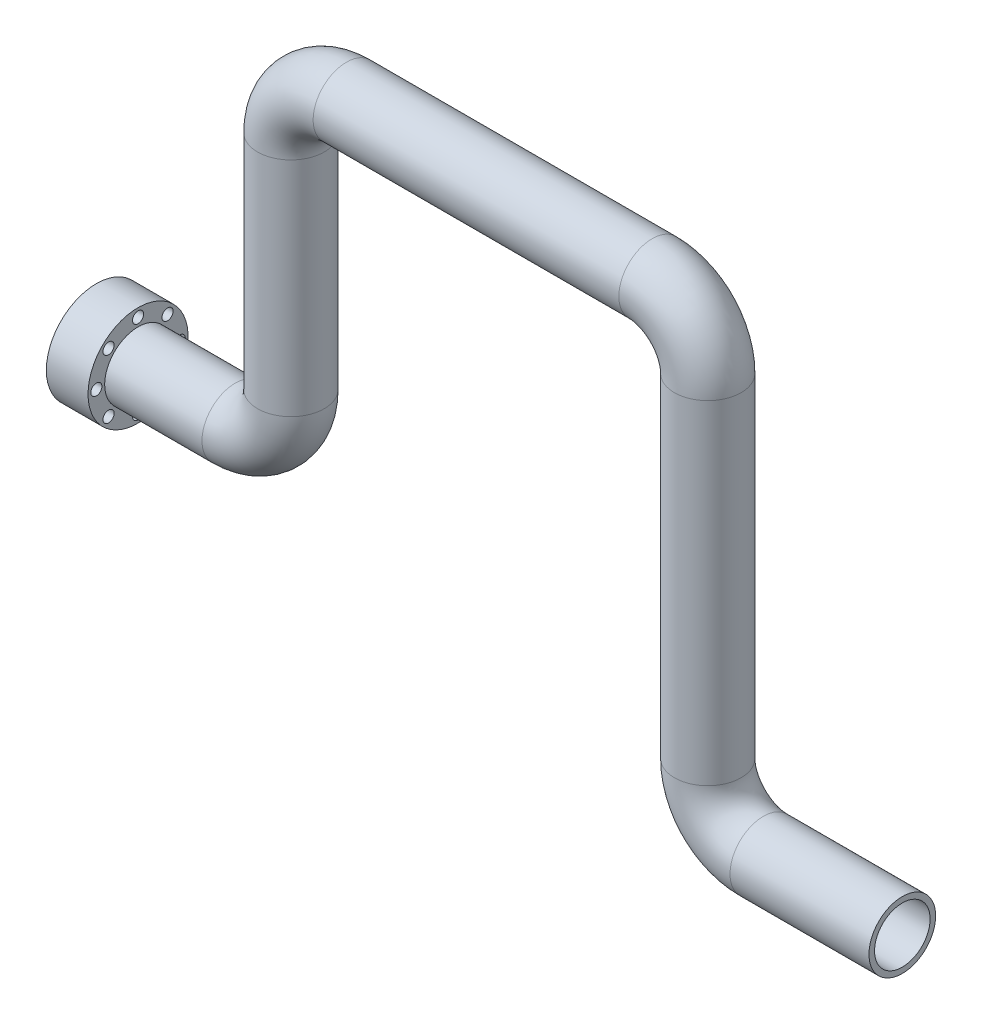
ISO-10303-21;
HEADER;
FILE_DESCRIPTION(('STEP AP214'),'2;1');
FILE_NAME('part.step','',(''),(''),'','','');
FILE_SCHEMA(('AUTOMOTIVE_DESIGN { 1 0 10303 214 1 1 1 1 }'));
ENDSEC;
DATA;
#1=APPLICATION_CONTEXT('core data for automotive mechanical design processes');
#2=APPLICATION_PROTOCOL_DEFINITION('international standard','automotive_design',2000,#1);
#3=PRODUCT_CONTEXT('',#1,'mechanical');
#4=PRODUCT('Part','Part','',(#3));
#5=PRODUCT_RELATED_PRODUCT_CATEGORY('part','',(#4));
#6=PRODUCT_DEFINITION_FORMATION('','',#4);
#7=PRODUCT_DEFINITION_CONTEXT('part definition',#1,'design');
#8=PRODUCT_DEFINITION('design','',#6,#7);
#9=PRODUCT_DEFINITION_SHAPE('','',#8);
#10=(LENGTH_UNIT() NAMED_UNIT(*) SI_UNIT(.MILLI.,.METRE.));
#11=(NAMED_UNIT(*) PLANE_ANGLE_UNIT() SI_UNIT($,.RADIAN.));
#12=(NAMED_UNIT(*) SI_UNIT($,.STERADIAN.) SOLID_ANGLE_UNIT());
#13=UNCERTAINTY_MEASURE_WITH_UNIT(LENGTH_MEASURE(1.E-05),#10,'distance_accuracy_value','');
#14=(GEOMETRIC_REPRESENTATION_CONTEXT(3) GLOBAL_UNCERTAINTY_ASSIGNED_CONTEXT((#13)) GLOBAL_UNIT_ASSIGNED_CONTEXT((#10,
#11,#12)) REPRESENTATION_CONTEXT('',''));
#15=CARTESIAN_POINT('',(0.,0.,0.));
#16=DIRECTION('',(0.,0.,1.));
#17=DIRECTION('',(1.,0.,0.));
#18=AXIS2_PLACEMENT_3D('',#15,#16,#17);
#19=CARTESIAN_POINT('',(7.5,0.,0.));
#20=DIRECTION('',(-1.,0.,0.));
#21=DIRECTION('',(0.,0.,1.));
#22=AXIS2_PLACEMENT_3D('',#19,#20,#21);
#23=CYLINDRICAL_SURFACE('',#22,9.);
#24=CARTESIAN_POINT('',(7.5,0.,0.));
#25=DIRECTION('',(-1.,0.,0.));
#26=DIRECTION('',(0.,0.,1.));
#27=AXIS2_PLACEMENT_3D('',#24,#25,#26);
#28=CIRCLE('',#27,9.);
#29=CARTESIAN_POINT('',(7.5,0.,9.));
#30=VERTEX_POINT('',#29);
#31=EDGE_CURVE('E11',#30,#30,#28,.T.);
#32=ORIENTED_EDGE('',*,*,#31,.T.);
#33=EDGE_LOOP('',(#32));
#34=FACE_BOUND('',#33,.T.);
#35=CARTESIAN_POINT('',(0.,0.,0.));
#36=DIRECTION('',(-1.,0.,0.));
#37=DIRECTION('',(0.,0.,1.));
#38=AXIS2_PLACEMENT_3D('',#35,#36,#37);
#39=CIRCLE('',#38,9.);
#40=CARTESIAN_POINT('',(0.,0.,9.));
#41=VERTEX_POINT('',#40);
#42=EDGE_CURVE('E54',#41,#41,#39,.T.);
#43=ORIENTED_EDGE('',*,*,#42,.F.);
#44=EDGE_LOOP('',(#43));
#45=FACE_BOUND('',#44,.T.);
#46=ADVANCED_FACE('F51',(#34,#45),#23,.T.);
#47=CARTESIAN_POINT('',(7.5,0.,0.));
#48=DIRECTION('',(-1.,0.,0.));
#49=DIRECTION('',(0.,0.,1.));
#50=AXIS2_PLACEMENT_3D('',#47,#48,#49);
#51=PLANE('',#50);
#52=CARTESIAN_POINT('',(7.5,5.3033008588991,5.30330085889912));
#53=DIRECTION('',(-1.,0.,0.));
#54=DIRECTION('',(0.,0.,1.));
#55=AXIS2_PLACEMENT_3D('',#52,#53,#54);
#56=CIRCLE('',#55,1.);
#57=CARTESIAN_POINT('',(7.5,5.3033008588991,6.30330085889912));
#58=VERTEX_POINT('',#57);
#59=EDGE_CURVE('E66',#58,#58,#56,.T.);
#60=ORIENTED_EDGE('',*,*,#59,.T.);
#61=EDGE_LOOP('',(#60));
#62=FACE_BOUND('',#61,.T.);
#63=CARTESIAN_POINT('',(7.5,0.,7.5));
#64=DIRECTION('',(-1.,0.,0.));
#65=DIRECTION('',(0.,0.,1.));
#66=AXIS2_PLACEMENT_3D('',#63,#64,#65);
#67=CIRCLE('',#66,1.);
#68=CARTESIAN_POINT('',(7.5,0.,8.5));
#69=VERTEX_POINT('',#68);
#70=EDGE_CURVE('E71',#69,#69,#67,.T.);
#71=ORIENTED_EDGE('',*,*,#70,.T.);
#72=EDGE_LOOP('',(#71));
#73=FACE_BOUND('',#72,.T.);
#74=CARTESIAN_POINT('',(7.5,7.5,0.));
#75=DIRECTION('',(-1.,0.,0.));
#76=DIRECTION('',(0.,0.,1.));
#77=AXIS2_PLACEMENT_3D('',#74,#75,#76);
#78=CIRCLE('',#77,1.);
#79=CARTESIAN_POINT('',(7.5,7.5,1.));
#80=VERTEX_POINT('',#79);
#81=EDGE_CURVE('E74',#80,#80,#78,.T.);
#82=ORIENTED_EDGE('',*,*,#81,.T.);
#83=EDGE_LOOP('',(#82));
#84=FACE_BOUND('',#83,.T.);
#85=CARTESIAN_POINT('',(7.5,5.30330085889917,-5.30330085889904));
#86=DIRECTION('',(-1.,0.,0.));
#87=DIRECTION('',(0.,0.,1.));
#88=AXIS2_PLACEMENT_3D('',#85,#86,#87);
#89=CIRCLE('',#88,1.);
#90=CARTESIAN_POINT('',(7.5,5.30330085889917,-4.30330085889904));
#91=VERTEX_POINT('',#90);
#92=EDGE_CURVE('E77',#91,#91,#89,.T.);
#93=ORIENTED_EDGE('',*,*,#92,.T.);
#94=EDGE_LOOP('',(#93));
#95=FACE_BOUND('',#94,.T.);
#96=CARTESIAN_POINT('',(7.5,-5.30330085889906,-5.30330085889915));
#97=DIRECTION('',(-1.,0.,0.));
#98=DIRECTION('',(0.,0.,1.));
#99=AXIS2_PLACEMENT_3D('',#96,#97,#98);
#100=CIRCLE('',#99,1.);
#101=CARTESIAN_POINT('',(7.5,-5.30330085889906,-4.30330085889915));
#102=VERTEX_POINT('',#101);
#103=EDGE_CURVE('E80',#102,#102,#100,.T.);
#104=ORIENTED_EDGE('',*,*,#103,.T.);
#105=EDGE_LOOP('',(#104));
#106=FACE_BOUND('',#105,.T.);
#107=CARTESIAN_POINT('',(7.5,-5.30330085889913,5.30330085889908));
#108=DIRECTION('',(-1.,0.,0.));
#109=DIRECTION('',(0.,0.,1.));
#110=AXIS2_PLACEMENT_3D('',#107,#108,#109);
#111=CIRCLE('',#110,0.999999999999999);
#112=CARTESIAN_POINT('',(7.5,-5.30330085889913,6.30330085889908));
#113=VERTEX_POINT('',#112);
#114=EDGE_CURVE('E83',#113,#113,#111,.T.);
#115=ORIENTED_EDGE('',*,*,#114,.T.);
#116=EDGE_LOOP('',(#115));
#117=FACE_BOUND('',#116,.T.);
#118=CARTESIAN_POINT('',(7.5,0.,-7.5));
#119=DIRECTION('',(-1.,0.,0.));
#120=DIRECTION('',(0.,0.,1.));
#121=AXIS2_PLACEMENT_3D('',#118,#119,#120);
#122=CIRCLE('',#121,1.);
#123=CARTESIAN_POINT('',(7.5,0.,-6.5));
#124=VERTEX_POINT('',#123);
#125=EDGE_CURVE('E86',#124,#124,#122,.T.);
#126=ORIENTED_EDGE('',*,*,#125,.T.);
#127=EDGE_LOOP('',(#126));
#128=FACE_BOUND('',#127,.T.);
#129=CARTESIAN_POINT('',(7.5,-7.5,0.));
#130=DIRECTION('',(-1.,0.,0.));
#131=DIRECTION('',(0.,0.,1.));
#132=AXIS2_PLACEMENT_3D('',#129,#130,#131);
#133=CIRCLE('',#132,1.);
#134=CARTESIAN_POINT('',(7.5,-7.5,0.999999999999948));
#135=VERTEX_POINT('',#134);
#136=EDGE_CURVE('E89',#135,#135,#133,.T.);
#137=ORIENTED_EDGE('',*,*,#136,.T.);
#138=EDGE_LOOP('',(#137));
#139=FACE_BOUND('',#138,.T.);
#140=CARTESIAN_POINT('',(7.5,0.,0.));
#141=DIRECTION('',(-1.,0.,0.));
#142=DIRECTION('',(0.,0.,1.));
#143=AXIS2_PLACEMENT_3D('',#140,#141,#142);
#144=CIRCLE('',#143,6.);
#145=CARTESIAN_POINT('',(7.5,0.,6.));
#146=VERTEX_POINT('',#145);
#147=EDGE_CURVE('E61',#146,#146,#144,.T.);
#148=ORIENTED_EDGE('',*,*,#147,.T.);
#149=EDGE_LOOP('',(#148));
#150=FACE_BOUND('',#149,.T.);
#151=ORIENTED_EDGE('',*,*,#31,.F.);
#152=EDGE_LOOP('',(#151));
#153=FACE_BOUND('',#152,.T.);
#154=ADVANCED_FACE('F124',(#62,#73,#84,#95,#106,#117,#128,#139,#150,#153),#51,.F.);
#155=CARTESIAN_POINT('',(0.,0.,0.));
#156=DIRECTION('',(-1.,0.,0.));
#157=DIRECTION('',(0.,0.,1.));
#158=AXIS2_PLACEMENT_3D('',#155,#156,#157);
#159=PLANE('',#158);
#160=CARTESIAN_POINT('',(0.,5.3033008588991,5.30330085889912));
#161=DIRECTION('',(-1.,0.,0.));
#162=DIRECTION('',(0.,0.,1.));
#163=AXIS2_PLACEMENT_3D('',#160,#161,#162);
#164=CIRCLE('',#163,1.);
#165=CARTESIAN_POINT('',(0.,5.3033008588991,6.30330085889912));
#166=VERTEX_POINT('',#165);
#167=EDGE_CURVE('E92',#166,#166,#164,.T.);
#168=ORIENTED_EDGE('',*,*,#167,.F.);
#169=EDGE_LOOP('',(#168));
#170=FACE_BOUND('',#169,.T.);
#171=CARTESIAN_POINT('',(0.,0.,7.5));
#172=DIRECTION('',(-1.,0.,0.));
#173=DIRECTION('',(0.,0.,1.));
#174=AXIS2_PLACEMENT_3D('',#171,#172,#173);
#175=CIRCLE('',#174,1.);
#176=CARTESIAN_POINT('',(0.,0.,8.5));
#177=VERTEX_POINT('',#176);
#178=EDGE_CURVE('E111',#177,#177,#175,.T.);
#179=ORIENTED_EDGE('',*,*,#178,.F.);
#180=EDGE_LOOP('',(#179));
#181=FACE_BOUND('',#180,.T.);
#182=CARTESIAN_POINT('',(0.,7.5,0.));
#183=DIRECTION('',(-1.,0.,0.));
#184=DIRECTION('',(0.,0.,1.));
#185=AXIS2_PLACEMENT_3D('',#182,#183,#184);
#186=CIRCLE('',#185,1.);
#187=CARTESIAN_POINT('',(0.,7.5,1.));
#188=VERTEX_POINT('',#187);
#189=EDGE_CURVE('E108',#188,#188,#186,.T.);
#190=ORIENTED_EDGE('',*,*,#189,.F.);
#191=EDGE_LOOP('',(#190));
#192=FACE_BOUND('',#191,.T.);
#193=CARTESIAN_POINT('',(0.,5.30330085889917,-5.30330085889904));
#194=DIRECTION('',(-1.,0.,0.));
#195=DIRECTION('',(0.,0.,1.));
#196=AXIS2_PLACEMENT_3D('',#193,#194,#195);
#197=CIRCLE('',#196,1.);
#198=CARTESIAN_POINT('',(0.,5.30330085889917,-4.30330085889904));
#199=VERTEX_POINT('',#198);
#200=EDGE_CURVE('E105',#199,#199,#197,.T.);
#201=ORIENTED_EDGE('',*,*,#200,.F.);
#202=EDGE_LOOP('',(#201));
#203=FACE_BOUND('',#202,.T.);
#204=CARTESIAN_POINT('',(0.,-5.30330085889906,-5.30330085889915));
#205=DIRECTION('',(-1.,0.,0.));
#206=DIRECTION('',(0.,0.,1.));
#207=AXIS2_PLACEMENT_3D('',#204,#205,#206);
#208=CIRCLE('',#207,1.);
#209=CARTESIAN_POINT('',(0.,-5.30330085889906,-4.30330085889915));
#210=VERTEX_POINT('',#209);
#211=EDGE_CURVE('E102',#210,#210,#208,.T.);
#212=ORIENTED_EDGE('',*,*,#211,.F.);
#213=EDGE_LOOP('',(#212));
#214=FACE_BOUND('',#213,.T.);
#215=CARTESIAN_POINT('',(0.,-5.30330085889913,5.30330085889908));
#216=DIRECTION('',(-1.,0.,0.));
#217=DIRECTION('',(0.,0.,1.));
#218=AXIS2_PLACEMENT_3D('',#215,#216,#217);
#219=CIRCLE('',#218,0.999999999999999);
#220=CARTESIAN_POINT('',(0.,-5.30330085889913,6.30330085889908));
#221=VERTEX_POINT('',#220);
#222=EDGE_CURVE('E99',#221,#221,#219,.T.);
#223=ORIENTED_EDGE('',*,*,#222,.F.);
#224=EDGE_LOOP('',(#223));
#225=FACE_BOUND('',#224,.T.);
#226=CARTESIAN_POINT('',(0.,0.,-7.5));
#227=DIRECTION('',(-1.,0.,0.));
#228=DIRECTION('',(0.,0.,1.));
#229=AXIS2_PLACEMENT_3D('',#226,#227,#228);
#230=CIRCLE('',#229,1.);
#231=CARTESIAN_POINT('',(0.,0.,-6.5));
#232=VERTEX_POINT('',#231);
#233=EDGE_CURVE('E96',#232,#232,#230,.T.);
#234=ORIENTED_EDGE('',*,*,#233,.F.);
#235=EDGE_LOOP('',(#234));
#236=FACE_BOUND('',#235,.T.);
#237=CARTESIAN_POINT('',(0.,-7.5,0.));
#238=DIRECTION('',(-1.,0.,0.));
#239=DIRECTION('',(0.,0.,1.));
#240=AXIS2_PLACEMENT_3D('',#237,#238,#239);
#241=CIRCLE('',#240,1.);
#242=CARTESIAN_POINT('',(0.,-7.5,0.999999999999948));
#243=VERTEX_POINT('',#242);
#244=EDGE_CURVE('E93',#243,#243,#241,.T.);
#245=ORIENTED_EDGE('',*,*,#244,.F.);
#246=EDGE_LOOP('',(#245));
#247=FACE_BOUND('',#246,.T.);
#248=CARTESIAN_POINT('',(0.,0.,0.));
#249=DIRECTION('',(-1.,0.,0.));
#250=DIRECTION('',(0.,0.,1.));
#251=AXIS2_PLACEMENT_3D('',#248,#249,#250);
#252=CIRCLE('',#251,6.);
#253=CARTESIAN_POINT('',(0.,0.,6.));
#254=VERTEX_POINT('',#253);
#255=EDGE_CURVE('E63',#254,#254,#252,.T.);
#256=ORIENTED_EDGE('',*,*,#255,.F.);
#257=EDGE_LOOP('',(#256));
#258=FACE_BOUND('',#257,.T.);
#259=ORIENTED_EDGE('',*,*,#42,.T.);
#260=EDGE_LOOP('',(#259));
#261=FACE_BOUND('',#260,.T.);
#262=ADVANCED_FACE('F120',(#170,#181,#192,#203,#214,#225,#236,#247,#258,#261),#159,.T.);
#263=CARTESIAN_POINT('',(7.5,0.,0.));
#264=DIRECTION('',(-1.,0.,0.));
#265=DIRECTION('',(0.,0.,1.));
#266=AXIS2_PLACEMENT_3D('',#263,#264,#265);
#267=CYLINDRICAL_SURFACE('',#266,6.);
#268=ORIENTED_EDGE('',*,*,#147,.F.);
#269=EDGE_LOOP('',(#268));
#270=FACE_BOUND('',#269,.T.);
#271=ORIENTED_EDGE('',*,*,#255,.T.);
#272=EDGE_LOOP('',(#271));
#273=FACE_BOUND('',#272,.T.);
#274=ADVANCED_FACE('F123',(#270,#273),#267,.F.);
#275=CARTESIAN_POINT('',(10.,-7.5,0.));
#276=DIRECTION('',(-1.,0.,0.));
#277=DIRECTION('',(0.,0.,1.));
#278=AXIS2_PLACEMENT_3D('',#275,#276,#277);
#279=CYLINDRICAL_SURFACE('',#278,1.);
#280=ORIENTED_EDGE('',*,*,#244,.T.);
#281=EDGE_LOOP('',(#280));
#282=FACE_BOUND('',#281,.T.);
#283=ORIENTED_EDGE('',*,*,#136,.F.);
#284=EDGE_LOOP('',(#283));
#285=FACE_BOUND('',#284,.T.);
#286=ADVANCED_FACE('F155',(#282,#285),#279,.F.);
#287=CARTESIAN_POINT('',(10.,0.,-7.5));
#288=DIRECTION('',(-1.,0.,0.));
#289=DIRECTION('',(0.,0.,1.));
#290=AXIS2_PLACEMENT_3D('',#287,#288,#289);
#291=CYLINDRICAL_SURFACE('',#290,1.);
#292=ORIENTED_EDGE('',*,*,#233,.T.);
#293=EDGE_LOOP('',(#292));
#294=FACE_BOUND('',#293,.T.);
#295=ORIENTED_EDGE('',*,*,#125,.F.);
#296=EDGE_LOOP('',(#295));
#297=FACE_BOUND('',#296,.T.);
#298=ADVANCED_FACE('F159',(#294,#297),#291,.F.);
#299=CARTESIAN_POINT('',(10.,-5.30330085889913,5.30330085889908));
#300=DIRECTION('',(-1.,0.,0.));
#301=DIRECTION('',(0.,0.,1.));
#302=AXIS2_PLACEMENT_3D('',#299,#300,#301);
#303=CYLINDRICAL_SURFACE('',#302,0.999999999999999);
#304=ORIENTED_EDGE('',*,*,#222,.T.);
#305=EDGE_LOOP('',(#304));
#306=FACE_BOUND('',#305,.T.);
#307=ORIENTED_EDGE('',*,*,#114,.F.);
#308=EDGE_LOOP('',(#307));
#309=FACE_BOUND('',#308,.T.);
#310=ADVANCED_FACE('F163',(#306,#309),#303,.F.);
#311=CARTESIAN_POINT('',(10.,-5.30330085889906,-5.30330085889915));
#312=DIRECTION('',(-1.,0.,0.));
#313=DIRECTION('',(0.,0.,1.));
#314=AXIS2_PLACEMENT_3D('',#311,#312,#313);
#315=CYLINDRICAL_SURFACE('',#314,1.);
#316=ORIENTED_EDGE('',*,*,#211,.T.);
#317=EDGE_LOOP('',(#316));
#318=FACE_BOUND('',#317,.T.);
#319=ORIENTED_EDGE('',*,*,#103,.F.);
#320=EDGE_LOOP('',(#319));
#321=FACE_BOUND('',#320,.T.);
#322=ADVANCED_FACE('F167',(#318,#321),#315,.F.);
#323=CARTESIAN_POINT('',(10.,5.30330085889917,-5.30330085889904));
#324=DIRECTION('',(-1.,0.,0.));
#325=DIRECTION('',(0.,0.,1.));
#326=AXIS2_PLACEMENT_3D('',#323,#324,#325);
#327=CYLINDRICAL_SURFACE('',#326,1.);
#328=ORIENTED_EDGE('',*,*,#200,.T.);
#329=EDGE_LOOP('',(#328));
#330=FACE_BOUND('',#329,.T.);
#331=ORIENTED_EDGE('',*,*,#92,.F.);
#332=EDGE_LOOP('',(#331));
#333=FACE_BOUND('',#332,.T.);
#334=ADVANCED_FACE('F171',(#330,#333),#327,.F.);
#335=CARTESIAN_POINT('',(10.,7.5,0.));
#336=DIRECTION('',(-1.,0.,0.));
#337=DIRECTION('',(0.,0.,1.));
#338=AXIS2_PLACEMENT_3D('',#335,#336,#337);
#339=CYLINDRICAL_SURFACE('',#338,1.);
#340=ORIENTED_EDGE('',*,*,#189,.T.);
#341=EDGE_LOOP('',(#340));
#342=FACE_BOUND('',#341,.T.);
#343=ORIENTED_EDGE('',*,*,#81,.F.);
#344=EDGE_LOOP('',(#343));
#345=FACE_BOUND('',#344,.T.);
#346=ADVANCED_FACE('F175',(#342,#345),#339,.F.);
#347=CARTESIAN_POINT('',(10.,0.,7.5));
#348=DIRECTION('',(-1.,0.,0.));
#349=DIRECTION('',(0.,0.,1.));
#350=AXIS2_PLACEMENT_3D('',#347,#348,#349);
#351=CYLINDRICAL_SURFACE('',#350,1.);
#352=ORIENTED_EDGE('',*,*,#178,.T.);
#353=EDGE_LOOP('',(#352));
#354=FACE_BOUND('',#353,.T.);
#355=ORIENTED_EDGE('',*,*,#70,.F.);
#356=EDGE_LOOP('',(#355));
#357=FACE_BOUND('',#356,.T.);
#358=ADVANCED_FACE('F179',(#354,#357),#351,.F.);
#359=CARTESIAN_POINT('',(10.,5.3033008588991,5.30330085889912));
#360=DIRECTION('',(-1.,0.,0.));
#361=DIRECTION('',(0.,0.,1.));
#362=AXIS2_PLACEMENT_3D('',#359,#360,#361);
#363=CYLINDRICAL_SURFACE('',#362,1.);
#364=ORIENTED_EDGE('',*,*,#167,.T.);
#365=EDGE_LOOP('',(#364));
#366=FACE_BOUND('',#365,.T.);
#367=ORIENTED_EDGE('',*,*,#59,.F.);
#368=EDGE_LOOP('',(#367));
#369=FACE_BOUND('',#368,.T.);
#370=ADVANCED_FACE('F117',(#366,#369),#363,.F.);
#371=CLOSED_SHELL('',(#46,#154,#262,#274,#286,#298,#310,#322,#334,#346,#358,#370));
#372=MANIFOLD_SOLID_BREP('B2',#371);
#373=CARTESIAN_POINT('',(0.,0.,0.));
#374=DIRECTION('',(1.,0.,0.));
#375=DIRECTION('',(0.,0.,-1.));
#376=AXIS2_PLACEMENT_3D('',#373,#374,#375);
#377=CYLINDRICAL_SURFACE('',#376,6.);
#378=CARTESIAN_POINT('',(24.9999999999999,0.,0.));
#379=DIRECTION('',(1.,0.,0.));
#380=DIRECTION('',(0.,0.,-1.));
#381=AXIS2_PLACEMENT_3D('',#378,#379,#380);
#382=CIRCLE('',#381,6.);
#383=CARTESIAN_POINT('',(24.9999999999999,-6.,0.));
#384=VERTEX_POINT('',#383);
#385=EDGE_CURVE('E309',#384,#384,#382,.T.);
#386=ORIENTED_EDGE('',*,*,#385,.F.);
#387=EDGE_LOOP('',(#386));
#388=FACE_BOUND('',#387,.T.);
#389=CARTESIAN_POINT('',(0.,0.,0.));
#390=DIRECTION('',(1.,0.,0.));
#391=DIRECTION('',(0.,0.,-1.));
#392=AXIS2_PLACEMENT_3D('',#389,#390,#391);
#393=CIRCLE('',#392,6.);
#394=CARTESIAN_POINT('',(0.,0.,-6.));
#395=VERTEX_POINT('',#394);
#396=EDGE_CURVE('E305',#395,#395,#393,.T.);
#397=ORIENTED_EDGE('',*,*,#396,.T.);
#398=EDGE_LOOP('',(#397));
#399=FACE_BOUND('',#398,.T.);
#400=ADVANCED_FACE('F281',(#388,#399),#377,.T.);
#401=CARTESIAN_POINT('',(25.,10.,0.));
#402=DIRECTION('',(0.,0.,1.));
#403=DIRECTION('',(1.,0.,0.));
#404=AXIS2_PLACEMENT_3D('',#401,#402,#403);
#405=TOROIDAL_SURFACE('',#404,10.,6.);
#406=CARTESIAN_POINT('',(35.,10.0000000000001,0.));
#407=DIRECTION('',(0.,1.,0.));
#408=DIRECTION('',(0.,0.,-1.));
#409=AXIS2_PLACEMENT_3D('',#406,#407,#408);
#410=CIRCLE('',#409,6.);
#411=CARTESIAN_POINT('',(41.,10.0000000000001,0.));
#412=VERTEX_POINT('',#411);
#413=EDGE_CURVE('E313',#412,#412,#410,.T.);
#414=CARTESIAN_POINT('',(25.,10.,0.));
#415=DIRECTION('',(0.,0.,1.));
#416=DIRECTION('',(1.,0.,0.));
#417=AXIS2_PLACEMENT_3D('',#414,#415,#416);
#418=CIRCLE('',#417,16.);
#419=EDGE_CURVE('',#384,#412,#418,.T.);
#420=ORIENTED_EDGE('',*,*,#385,.T.);
#421=ORIENTED_EDGE('',*,*,#413,.F.);
#422=ORIENTED_EDGE('',*,*,#419,.T.);
#423=ORIENTED_EDGE('',*,*,#419,.F.);
#424=EDGE_LOOP('',(#420,#422,#421,#423));
#425=FACE_BOUND('',#424,.T.);
#426=ADVANCED_FACE('F377',(#425),#405,.T.);
#427=CARTESIAN_POINT('',(35.,10.0000000000001,0.));
#428=DIRECTION('',(0.,1.,0.));
#429=DIRECTION('',(0.,0.,1.));
#430=AXIS2_PLACEMENT_3D('',#427,#428,#429);
#431=CYLINDRICAL_SURFACE('',#430,6.);
#432=CARTESIAN_POINT('',(35.,49.9999999999999,0.));
#433=DIRECTION('',(0.,1.,0.));
#434=DIRECTION('',(0.,0.,-1.));
#435=AXIS2_PLACEMENT_3D('',#432,#433,#434);
#436=CIRCLE('',#435,6.);
#437=CARTESIAN_POINT('',(29.,49.9999999999999,0.));
#438=VERTEX_POINT('',#437);
#439=EDGE_CURVE('E317',#438,#438,#436,.T.);
#440=ORIENTED_EDGE('',*,*,#439,.F.);
#441=EDGE_LOOP('',(#440));
#442=FACE_BOUND('',#441,.T.);
#443=ORIENTED_EDGE('',*,*,#413,.T.);
#444=EDGE_LOOP('',(#443));
#445=FACE_BOUND('',#444,.T.);
#446=ADVANCED_FACE('F381',(#442,#445),#431,.T.);
#447=CARTESIAN_POINT('',(45.,50.,0.));
#448=DIRECTION('',(0.,0.,-1.));
#449=DIRECTION('',(-1.,0.,0.));
#450=AXIS2_PLACEMENT_3D('',#447,#448,#449);
#451=TOROIDAL_SURFACE('',#450,9.99999999999999,6.);
#452=CARTESIAN_POINT('',(45.0000000000001,60.,0.));
#453=DIRECTION('',(1.,0.,0.));
#454=DIRECTION('',(0.,0.,-1.));
#455=AXIS2_PLACEMENT_3D('',#452,#453,#454);
#456=CIRCLE('',#455,6.);
#457=CARTESIAN_POINT('',(45.0000000000001,66.,0.));
#458=VERTEX_POINT('',#457);
#459=EDGE_CURVE('E321',#458,#458,#456,.T.);
#460=CARTESIAN_POINT('',(45.,50.,0.));
#461=DIRECTION('',(0.,0.,-1.));
#462=DIRECTION('',(-1.,0.,0.));
#463=AXIS2_PLACEMENT_3D('',#460,#461,#462);
#464=CIRCLE('',#463,16.);
#465=EDGE_CURVE('',#438,#458,#464,.T.);
#466=ORIENTED_EDGE('',*,*,#439,.T.);
#467=ORIENTED_EDGE('',*,*,#459,.F.);
#468=ORIENTED_EDGE('',*,*,#465,.T.);
#469=ORIENTED_EDGE('',*,*,#465,.F.);
#470=EDGE_LOOP('',(#466,#468,#467,#469));
#471=FACE_BOUND('',#470,.T.);
#472=ADVANCED_FACE('F385',(#471),#451,.T.);
#473=CARTESIAN_POINT('',(45.0000000000001,60.,0.));
#474=DIRECTION('',(1.,0.,0.));
#475=DIRECTION('',(0.,0.,-1.));
#476=AXIS2_PLACEMENT_3D('',#473,#474,#475);
#477=CYLINDRICAL_SURFACE('',#476,6.);
#478=CARTESIAN_POINT('',(99.9999999999999,60.,0.));
#479=DIRECTION('',(1.,0.,0.));
#480=DIRECTION('',(0.,0.,-1.));
#481=AXIS2_PLACEMENT_3D('',#478,#479,#480);
#482=CIRCLE('',#481,6.);
#483=CARTESIAN_POINT('',(99.9999999999999,66.,0.));
#484=VERTEX_POINT('',#483);
#485=EDGE_CURVE('E325',#484,#484,#482,.T.);
#486=ORIENTED_EDGE('',*,*,#485,.F.);
#487=EDGE_LOOP('',(#486));
#488=FACE_BOUND('',#487,.T.);
#489=ORIENTED_EDGE('',*,*,#459,.T.);
#490=EDGE_LOOP('',(#489));
#491=FACE_BOUND('',#490,.T.);
#492=ADVANCED_FACE('F389',(#488,#491),#477,.T.);
#493=CARTESIAN_POINT('',(100.,50.,0.));
#494=DIRECTION('',(0.,0.,-1.));
#495=DIRECTION('',(-1.,0.,0.));
#496=AXIS2_PLACEMENT_3D('',#493,#494,#495);
#497=TOROIDAL_SURFACE('',#496,10.,6.);
#498=CARTESIAN_POINT('',(110.,50.,0.));
#499=DIRECTION('',(0.,-1.,0.));
#500=DIRECTION('',(0.,0.,-1.));
#501=AXIS2_PLACEMENT_3D('',#498,#499,#500);
#502=CIRCLE('',#501,6.);
#503=CARTESIAN_POINT('',(116.,50.,0.));
#504=VERTEX_POINT('',#503);
#505=EDGE_CURVE('E329',#504,#504,#502,.T.);
#506=CARTESIAN_POINT('',(100.,50.,0.));
#507=DIRECTION('',(0.,0.,-1.));
#508=DIRECTION('',(-1.,0.,0.));
#509=AXIS2_PLACEMENT_3D('',#506,#507,#508);
#510=CIRCLE('',#509,16.);
#511=EDGE_CURVE('',#484,#504,#510,.T.);
#512=ORIENTED_EDGE('',*,*,#485,.T.);
#513=ORIENTED_EDGE('',*,*,#505,.F.);
#514=ORIENTED_EDGE('',*,*,#511,.T.);
#515=ORIENTED_EDGE('',*,*,#511,.F.);
#516=EDGE_LOOP('',(#512,#514,#513,#515));
#517=FACE_BOUND('',#516,.T.);
#518=ADVANCED_FACE('F351',(#517),#497,.T.);
#519=CARTESIAN_POINT('',(110.,49.9999999999999,0.));
#520=DIRECTION('',(0.,-1.,0.));
#521=DIRECTION('',(1.,0.,0.));
#522=AXIS2_PLACEMENT_3D('',#519,#520,#521);
#523=CYLINDRICAL_SURFACE('',#522,6.);
#524=CARTESIAN_POINT('',(110.,-9.99999999999993,0.));
#525=DIRECTION('',(0.,-1.,0.));
#526=DIRECTION('',(0.,0.,-1.));
#527=AXIS2_PLACEMENT_3D('',#524,#525,#526);
#528=CIRCLE('',#527,6.);
#529=CARTESIAN_POINT('',(104.,-9.99999999999989,0.));
#530=VERTEX_POINT('',#529);
#531=EDGE_CURVE('E332',#530,#530,#528,.T.);
#532=ORIENTED_EDGE('',*,*,#531,.F.);
#533=EDGE_LOOP('',(#532));
#534=FACE_BOUND('',#533,.T.);
#535=ORIENTED_EDGE('',*,*,#505,.T.);
#536=EDGE_LOOP('',(#535));
#537=FACE_BOUND('',#536,.T.);
#538=ADVANCED_FACE('F344',(#534,#537),#523,.T.);
#539=CARTESIAN_POINT('',(120.,-10.,0.));
#540=DIRECTION('',(0.,0.,1.));
#541=DIRECTION('',(1.,0.,0.));
#542=AXIS2_PLACEMENT_3D('',#539,#540,#541);
#543=TOROIDAL_SURFACE('',#542,9.99999999999999,6.);
#544=CARTESIAN_POINT('',(120.,-20.,0.));
#545=DIRECTION('',(1.,0.,0.));
#546=DIRECTION('',(0.,0.,-1.));
#547=AXIS2_PLACEMENT_3D('',#544,#545,#546);
#548=CIRCLE('',#547,6.);
#549=CARTESIAN_POINT('',(120.,-26.,0.));
#550=VERTEX_POINT('',#549);
#551=EDGE_CURVE('E285',#550,#550,#548,.T.);
#552=CARTESIAN_POINT('',(120.,-10.,0.));
#553=DIRECTION('',(0.,0.,1.));
#554=DIRECTION('',(1.,0.,0.));
#555=AXIS2_PLACEMENT_3D('',#552,#553,#554);
#556=CIRCLE('',#555,16.);
#557=EDGE_CURVE('',#530,#550,#556,.T.);
#558=ORIENTED_EDGE('',*,*,#531,.T.);
#559=ORIENTED_EDGE('',*,*,#551,.F.);
#560=ORIENTED_EDGE('',*,*,#557,.T.);
#561=ORIENTED_EDGE('',*,*,#557,.F.);
#562=EDGE_LOOP('',(#558,#560,#559,#561));
#563=FACE_BOUND('',#562,.T.);
#564=ADVANCED_FACE('F342',(#563),#543,.T.);
#565=CARTESIAN_POINT('',(120.,-20.,0.));
#566=DIRECTION('',(1.,0.,0.));
#567=DIRECTION('',(0.,0.,-1.));
#568=AXIS2_PLACEMENT_3D('',#565,#566,#567);
#569=CYLINDRICAL_SURFACE('',#568,6.);
#570=CARTESIAN_POINT('',(145.,-20.,0.));
#571=DIRECTION('',(1.,0.,0.));
#572=DIRECTION('',(0.,0.,-1.));
#573=AXIS2_PLACEMENT_3D('',#570,#571,#572);
#574=CIRCLE('',#573,6.);
#575=CARTESIAN_POINT('',(145.,-20.,-6.));
#576=VERTEX_POINT('',#575);
#577=EDGE_CURVE('E300',#576,#576,#574,.T.);
#578=ORIENTED_EDGE('',*,*,#577,.F.);
#579=EDGE_LOOP('',(#578));
#580=FACE_BOUND('',#579,.T.);
#581=ORIENTED_EDGE('',*,*,#551,.T.);
#582=EDGE_LOOP('',(#581));
#583=FACE_BOUND('',#582,.T.);
#584=ADVANCED_FACE('F283',(#580,#583),#569,.T.);
#585=CARTESIAN_POINT('',(0.,0.,0.));
#586=DIRECTION('',(1.,0.,0.));
#587=DIRECTION('',(0.,0.,-1.));
#588=AXIS2_PLACEMENT_3D('',#585,#586,#587);
#589=PLANE('',#588);
#590=CARTESIAN_POINT('',(0.,0.,0.));
#591=DIRECTION('',(1.,0.,0.));
#592=DIRECTION('',(0.,0.,-1.));
#593=AXIS2_PLACEMENT_3D('',#590,#591,#592);
#594=CIRCLE('',#593,5.);
#595=CARTESIAN_POINT('',(0.,0.,-5.));
#596=VERTEX_POINT('',#595);
#597=EDGE_CURVE('E304',#596,#596,#594,.F.);
#598=ORIENTED_EDGE('',*,*,#597,.F.);
#599=EDGE_LOOP('',(#598));
#600=FACE_BOUND('',#599,.T.);
#601=ORIENTED_EDGE('',*,*,#396,.F.);
#602=EDGE_LOOP('',(#601));
#603=FACE_BOUND('',#602,.T.);
#604=ADVANCED_FACE('F349',(#600,#603),#589,.F.);
#605=CARTESIAN_POINT('',(145.,-20.,0.));
#606=DIRECTION('',(1.,0.,0.));
#607=DIRECTION('',(0.,0.,-1.));
#608=AXIS2_PLACEMENT_3D('',#605,#606,#607);
#609=PLANE('',#608);
#610=CARTESIAN_POINT('',(145.,-20.,0.));
#611=DIRECTION('',(1.,0.,0.));
#612=DIRECTION('',(0.,0.,-1.));
#613=AXIS2_PLACEMENT_3D('',#610,#611,#612);
#614=CIRCLE('',#613,5.);
#615=CARTESIAN_POINT('',(145.,-20.,-5.));
#616=VERTEX_POINT('',#615);
#617=EDGE_CURVE('E50',#616,#616,#614,.F.);
#618=ORIENTED_EDGE('',*,*,#617,.T.);
#619=EDGE_LOOP('',(#618));
#620=FACE_BOUND('',#619,.T.);
#621=ORIENTED_EDGE('',*,*,#577,.T.);
#622=EDGE_LOOP('',(#621));
#623=FACE_BOUND('',#622,.T.);
#624=ADVANCED_FACE('F368',(#620,#623),#609,.T.);
#625=CARTESIAN_POINT('',(0.,0.,0.));
#626=DIRECTION('',(1.,0.,0.));
#627=DIRECTION('',(0.,0.,-1.));
#628=AXIS2_PLACEMENT_3D('',#625,#626,#627);
#629=CYLINDRICAL_SURFACE('',#628,5.);
#630=CARTESIAN_POINT('',(24.9999999999999,0.,0.));
#631=DIRECTION('',(1.,0.,0.));
#632=DIRECTION('',(0.,0.,-1.));
#633=AXIS2_PLACEMENT_3D('',#630,#631,#632);
#634=CIRCLE('',#633,5.);
#635=CARTESIAN_POINT('',(24.9999999999999,-5.,0.));
#636=VERTEX_POINT('',#635);
#637=EDGE_CURVE('E549',#636,#636,#634,.F.);
#638=ORIENTED_EDGE('',*,*,#637,.F.);
#639=EDGE_LOOP('',(#638));
#640=FACE_BOUND('',#639,.T.);
#641=ORIENTED_EDGE('',*,*,#597,.T.);
#642=EDGE_LOOP('',(#641));
#643=FACE_BOUND('',#642,.T.);
#644=ADVANCED_FACE('F371',(#640,#643),#629,.F.);
#645=CARTESIAN_POINT('',(25.,10.,0.));
#646=DIRECTION('',(0.,0.,1.));
#647=DIRECTION('',(1.,0.,0.));
#648=AXIS2_PLACEMENT_3D('',#645,#646,#647);
#649=TOROIDAL_SURFACE('',#648,10.,5.);
#650=CARTESIAN_POINT('',(35.,10.0000000000001,0.));
#651=DIRECTION('',(0.,1.,0.));
#652=DIRECTION('',(0.,0.,-1.));
#653=AXIS2_PLACEMENT_3D('',#650,#651,#652);
#654=CIRCLE('',#653,5.);
#655=CARTESIAN_POINT('',(40.,10.0000000000001,0.));
#656=VERTEX_POINT('',#655);
#657=EDGE_CURVE('E545',#656,#656,#654,.F.);
#658=CARTESIAN_POINT('',(25.,10.,0.));
#659=DIRECTION('',(0.,0.,1.));
#660=DIRECTION('',(1.,0.,0.));
#661=AXIS2_PLACEMENT_3D('',#658,#659,#660);
#662=CIRCLE('',#661,15.);
#663=EDGE_CURVE('',#636,#656,#662,.T.);
#664=ORIENTED_EDGE('',*,*,#637,.T.);
#665=ORIENTED_EDGE('',*,*,#657,.F.);
#666=ORIENTED_EDGE('',*,*,#663,.T.);
#667=ORIENTED_EDGE('',*,*,#663,.F.);
#668=EDGE_LOOP('',(#664,#666,#665,#667));
#669=FACE_BOUND('',#668,.T.);
#670=ADVANCED_FACE('F452',(#669),#649,.F.);
#671=CARTESIAN_POINT('',(35.,10.0000000000001,0.));
#672=DIRECTION('',(0.,1.,0.));
#673=DIRECTION('',(0.,0.,1.));
#674=AXIS2_PLACEMENT_3D('',#671,#672,#673);
#675=CYLINDRICAL_SURFACE('',#674,5.);
#676=CARTESIAN_POINT('',(35.,49.9999999999999,0.));
#677=DIRECTION('',(0.,1.,0.));
#678=DIRECTION('',(0.,0.,-1.));
#679=AXIS2_PLACEMENT_3D('',#676,#677,#678);
#680=CIRCLE('',#679,5.);
#681=CARTESIAN_POINT('',(30.,49.9999999999999,0.));
#682=VERTEX_POINT('',#681);
#683=EDGE_CURVE('E541',#682,#682,#680,.F.);
#684=ORIENTED_EDGE('',*,*,#683,.F.);
#685=EDGE_LOOP('',(#684));
#686=FACE_BOUND('',#685,.T.);
#687=ORIENTED_EDGE('',*,*,#657,.T.);
#688=EDGE_LOOP('',(#687));
#689=FACE_BOUND('',#688,.T.);
#690=ADVANCED_FACE('F462',(#686,#689),#675,.F.);
#691=CARTESIAN_POINT('',(45.,50.,0.));
#692=DIRECTION('',(0.,0.,-1.));
#693=DIRECTION('',(-1.,0.,0.));
#694=AXIS2_PLACEMENT_3D('',#691,#692,#693);
#695=TOROIDAL_SURFACE('',#694,9.99999999999999,5.);
#696=CARTESIAN_POINT('',(45.0000000000001,60.,0.));
#697=DIRECTION('',(1.,0.,0.));
#698=DIRECTION('',(0.,0.,-1.));
#699=AXIS2_PLACEMENT_3D('',#696,#697,#698);
#700=CIRCLE('',#699,5.);
#701=CARTESIAN_POINT('',(45.0000000000001,65.,0.));
#702=VERTEX_POINT('',#701);
#703=EDGE_CURVE('E535',#702,#702,#700,.F.);
#704=CARTESIAN_POINT('',(45.,50.,0.));
#705=DIRECTION('',(0.,0.,-1.));
#706=DIRECTION('',(-1.,0.,0.));
#707=AXIS2_PLACEMENT_3D('',#704,#705,#706);
#708=CIRCLE('',#707,15.);
#709=EDGE_CURVE('',#682,#702,#708,.T.);
#710=ORIENTED_EDGE('',*,*,#683,.T.);
#711=ORIENTED_EDGE('',*,*,#703,.F.);
#712=ORIENTED_EDGE('',*,*,#709,.T.);
#713=ORIENTED_EDGE('',*,*,#709,.F.);
#714=EDGE_LOOP('',(#710,#712,#711,#713));
#715=FACE_BOUND('',#714,.T.);
#716=ADVANCED_FACE('F472',(#715),#695,.F.);
#717=CARTESIAN_POINT('',(45.0000000000001,60.,0.));
#718=DIRECTION('',(1.,0.,0.));
#719=DIRECTION('',(0.,0.,-1.));
#720=AXIS2_PLACEMENT_3D('',#717,#718,#719);
#721=CYLINDRICAL_SURFACE('',#720,5.);
#722=CARTESIAN_POINT('',(99.9999999999999,60.,0.));
#723=DIRECTION('',(1.,0.,0.));
#724=DIRECTION('',(0.,0.,-1.));
#725=AXIS2_PLACEMENT_3D('',#722,#723,#724);
#726=CIRCLE('',#725,5.);
#727=CARTESIAN_POINT('',(99.9999999999999,65.,0.));
#728=VERTEX_POINT('',#727);
#729=EDGE_CURVE('E530',#728,#728,#726,.F.);
#730=ORIENTED_EDGE('',*,*,#729,.F.);
#731=EDGE_LOOP('',(#730));
#732=FACE_BOUND('',#731,.T.);
#733=ORIENTED_EDGE('',*,*,#703,.T.);
#734=EDGE_LOOP('',(#733));
#735=FACE_BOUND('',#734,.T.);
#736=ADVANCED_FACE('F482',(#732,#735),#721,.F.);
#737=CARTESIAN_POINT('',(100.,50.,0.));
#738=DIRECTION('',(0.,0.,-1.));
#739=DIRECTION('',(-1.,0.,0.));
#740=AXIS2_PLACEMENT_3D('',#737,#738,#739);
#741=TOROIDAL_SURFACE('',#740,10.,5.);
#742=CARTESIAN_POINT('',(110.,50.,0.));
#743=DIRECTION('',(0.,-1.,0.));
#744=DIRECTION('',(0.,0.,-1.));
#745=AXIS2_PLACEMENT_3D('',#742,#743,#744);
#746=CIRCLE('',#745,5.);
#747=CARTESIAN_POINT('',(115.,50.,0.));
#748=VERTEX_POINT('',#747);
#749=EDGE_CURVE('E528',#748,#748,#746,.F.);
#750=CARTESIAN_POINT('',(100.,50.,0.));
#751=DIRECTION('',(0.,0.,-1.));
#752=DIRECTION('',(-1.,0.,0.));
#753=AXIS2_PLACEMENT_3D('',#750,#751,#752);
#754=CIRCLE('',#753,15.);
#755=EDGE_CURVE('',#728,#748,#754,.T.);
#756=ORIENTED_EDGE('',*,*,#729,.T.);
#757=ORIENTED_EDGE('',*,*,#749,.F.);
#758=ORIENTED_EDGE('',*,*,#755,.T.);
#759=ORIENTED_EDGE('',*,*,#755,.F.);
#760=EDGE_LOOP('',(#756,#758,#757,#759));
#761=FACE_BOUND('',#760,.T.);
#762=ADVANCED_FACE('F492',(#761),#741,.F.);
#763=CARTESIAN_POINT('',(110.,49.9999999999999,0.));
#764=DIRECTION('',(0.,-1.,0.));
#765=DIRECTION('',(1.,0.,0.));
#766=AXIS2_PLACEMENT_3D('',#763,#764,#765);
#767=CYLINDRICAL_SURFACE('',#766,5.);
#768=CARTESIAN_POINT('',(110.,-9.99999999999993,0.));
#769=DIRECTION('',(0.,-1.,0.));
#770=DIRECTION('',(0.,0.,-1.));
#771=AXIS2_PLACEMENT_3D('',#768,#769,#770);
#772=CIRCLE('',#771,5.);
#773=CARTESIAN_POINT('',(105.,-9.9999999999999,0.));
#774=VERTEX_POINT('',#773);
#775=EDGE_CURVE('E296',#774,#774,#772,.F.);
#776=ORIENTED_EDGE('',*,*,#775,.F.);
#777=EDGE_LOOP('',(#776));
#778=FACE_BOUND('',#777,.T.);
#779=ORIENTED_EDGE('',*,*,#749,.T.);
#780=EDGE_LOOP('',(#779));
#781=FACE_BOUND('',#780,.T.);
#782=ADVANCED_FACE('F362',(#778,#781),#767,.F.);
#783=CARTESIAN_POINT('',(120.,-10.,0.));
#784=DIRECTION('',(0.,0.,1.));
#785=DIRECTION('',(1.,0.,0.));
#786=AXIS2_PLACEMENT_3D('',#783,#784,#785);
#787=TOROIDAL_SURFACE('',#786,9.99999999999999,5.);
#788=CARTESIAN_POINT('',(120.,-20.,0.));
#789=DIRECTION('',(1.,0.,0.));
#790=DIRECTION('',(0.,0.,-1.));
#791=AXIS2_PLACEMENT_3D('',#788,#789,#790);
#792=CIRCLE('',#791,5.);
#793=CARTESIAN_POINT('',(120.,-25.,0.));
#794=VERTEX_POINT('',#793);
#795=EDGE_CURVE('E290',#794,#794,#792,.F.);
#796=CARTESIAN_POINT('',(120.,-10.,0.));
#797=DIRECTION('',(0.,0.,1.));
#798=DIRECTION('',(1.,0.,0.));
#799=AXIS2_PLACEMENT_3D('',#796,#797,#798);
#800=CIRCLE('',#799,15.);
#801=EDGE_CURVE('',#774,#794,#800,.T.);
#802=ORIENTED_EDGE('',*,*,#775,.T.);
#803=ORIENTED_EDGE('',*,*,#795,.F.);
#804=ORIENTED_EDGE('',*,*,#801,.T.);
#805=ORIENTED_EDGE('',*,*,#801,.F.);
#806=EDGE_LOOP('',(#802,#804,#803,#805));
#807=FACE_BOUND('',#806,.T.);
#808=ADVANCED_FACE('F356',(#807),#787,.F.);
#809=CARTESIAN_POINT('',(120.,-20.,0.));
#810=DIRECTION('',(1.,0.,0.));
#811=DIRECTION('',(0.,0.,-1.));
#812=AXIS2_PLACEMENT_3D('',#809,#810,#811);
#813=CYLINDRICAL_SURFACE('',#812,5.);
#814=ORIENTED_EDGE('',*,*,#617,.F.);
#815=EDGE_LOOP('',(#814));
#816=FACE_BOUND('',#815,.T.);
#817=ORIENTED_EDGE('',*,*,#795,.T.);
#818=EDGE_LOOP('',(#817));
#819=FACE_BOUND('',#818,.T.);
#820=ADVANCED_FACE('F354',(#816,#819),#813,.F.);
#821=CLOSED_SHELL('',(#400,#426,#446,#472,#492,#518,#538,#564,#584,#604,#624,#644,#670,#690,
#716,#736,#762,#782,#808,#820));
#822=MANIFOLD_SOLID_BREP('B6',#821);
#823=ADVANCED_BREP_SHAPE_REPRESENTATION('',(#18,#372,#822),#14);
#824=SHAPE_DEFINITION_REPRESENTATION(#9,#823);
ENDSEC;
END-ISO-10303-21;
